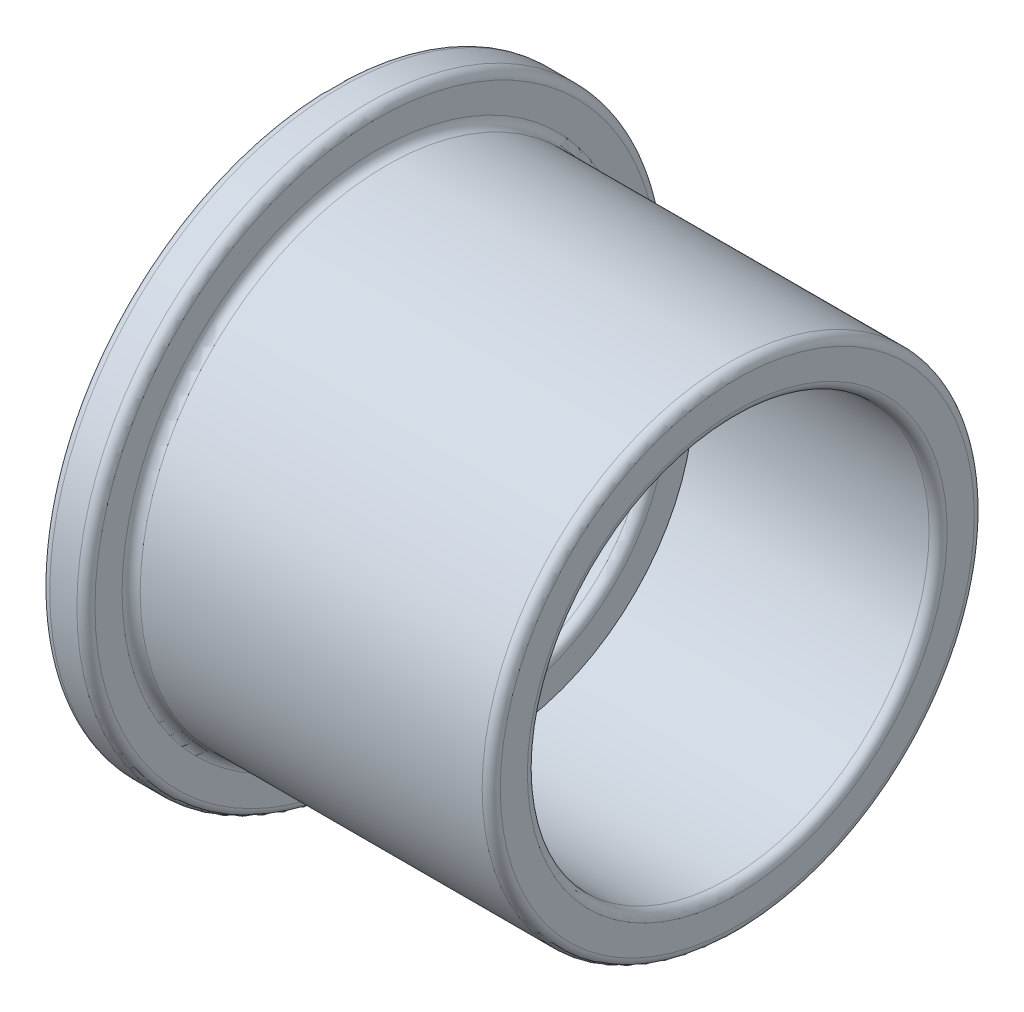
ISO-10303-21;
HEADER;
FILE_DESCRIPTION(('STEP AP214'),'2;1');
FILE_NAME('part.step','',(''),(''),'','','');
FILE_SCHEMA(('AUTOMOTIVE_DESIGN { 1 0 10303 214 1 1 1 1 }'));
ENDSEC;
DATA;
#1=APPLICATION_CONTEXT('core data for automotive mechanical design processes');
#2=APPLICATION_PROTOCOL_DEFINITION('international standard','automotive_design',2000,#1);
#3=PRODUCT_CONTEXT('',#1,'mechanical');
#4=PRODUCT('Part','Part','',(#3));
#5=PRODUCT_RELATED_PRODUCT_CATEGORY('part','',(#4));
#6=PRODUCT_DEFINITION_FORMATION('','',#4);
#7=PRODUCT_DEFINITION_CONTEXT('part definition',#1,'design');
#8=PRODUCT_DEFINITION('design','',#6,#7);
#9=PRODUCT_DEFINITION_SHAPE('','',#8);
#10=(LENGTH_UNIT() NAMED_UNIT(*) SI_UNIT(.MILLI.,.METRE.));
#11=(NAMED_UNIT(*) PLANE_ANGLE_UNIT() SI_UNIT($,.RADIAN.));
#12=(NAMED_UNIT(*) SI_UNIT($,.STERADIAN.) SOLID_ANGLE_UNIT());
#13=UNCERTAINTY_MEASURE_WITH_UNIT(LENGTH_MEASURE(1.E-05),#10,'distance_accuracy_value','');
#14=(GEOMETRIC_REPRESENTATION_CONTEXT(3) GLOBAL_UNCERTAINTY_ASSIGNED_CONTEXT((#13)) GLOBAL_UNIT_ASSIGNED_CONTEXT((#10,
#11,#12)) REPRESENTATION_CONTEXT('',''));
#15=CARTESIAN_POINT('',(0.,0.,0.));
#16=DIRECTION('',(0.,0.,1.));
#17=DIRECTION('',(1.,0.,0.));
#18=AXIS2_PLACEMENT_3D('',#15,#16,#17);
#19=CARTESIAN_POINT('',(-30.8496386192104,0.,0.));
#20=DIRECTION('',(-1.,0.,0.));
#21=DIRECTION('',(0.,0.,1.));
#22=AXIS2_PLACEMENT_3D('',#19,#20,#21);
#23=CYLINDRICAL_SURFACE('',#22,16.1);
#24=CARTESIAN_POINT('',(-10.5,0.,0.));
#25=DIRECTION('',(-1.,0.,0.));
#26=DIRECTION('',(0.,0.,1.));
#27=AXIS2_PLACEMENT_3D('',#24,#25,#26);
#28=CIRCLE('',#27,16.1);
#29=CARTESIAN_POINT('',(-10.5,0.,16.1));
#30=VERTEX_POINT('',#29);
#31=EDGE_CURVE('E75',#30,#30,#28,.T.);
#32=ORIENTED_EDGE('',*,*,#31,.T.);
#33=EDGE_LOOP('',(#32));
#34=FACE_BOUND('',#33,.T.);
#35=CARTESIAN_POINT('',(-12.,0.,0.));
#36=DIRECTION('',(1.,0.,0.));
#37=DIRECTION('',(0.,0.,-1.));
#38=AXIS2_PLACEMENT_3D('',#35,#36,#37);
#39=CIRCLE('',#38,16.1);
#40=CARTESIAN_POINT('',(-12.,0.,-16.1));
#41=VERTEX_POINT('',#40);
#42=EDGE_CURVE('E78',#41,#41,#39,.T.);
#43=ORIENTED_EDGE('',*,*,#42,.T.);
#44=EDGE_LOOP('',(#43));
#45=FACE_BOUND('',#44,.T.);
#46=ADVANCED_FACE('F31',(#34,#45),#23,.T.);
#47=CARTESIAN_POINT('',(-12.5,16.1,0.));
#48=DIRECTION('',(1.,0.,0.));
#49=DIRECTION('',(0.,0.,-1.));
#50=AXIS2_PLACEMENT_3D('',#47,#48,#49);
#51=PLANE('',#50);
#52=CARTESIAN_POINT('',(-12.5,0.,0.));
#53=DIRECTION('',(1.,0.,0.));
#54=DIRECTION('',(0.,0.,-1.));
#55=AXIS2_PLACEMENT_3D('',#52,#53,#54);
#56=CIRCLE('',#55,15.6);
#57=CARTESIAN_POINT('',(-12.5,0.,-15.6));
#58=VERTEX_POINT('',#57);
#59=EDGE_CURVE('E63',#58,#58,#56,.F.);
#60=ORIENTED_EDGE('',*,*,#59,.T.);
#61=EDGE_LOOP('',(#60));
#62=FACE_BOUND('',#61,.T.);
#63=CARTESIAN_POINT('',(-12.5,0.,0.));
#64=DIRECTION('',(1.,0.,0.));
#65=DIRECTION('',(0.,0.,-1.));
#66=AXIS2_PLACEMENT_3D('',#63,#64,#65);
#67=CIRCLE('',#66,9.6);
#68=CARTESIAN_POINT('',(-12.5,0.,-9.6));
#69=VERTEX_POINT('',#68);
#70=EDGE_CURVE('E66',#69,#69,#67,.T.);
#71=ORIENTED_EDGE('',*,*,#70,.T.);
#72=EDGE_LOOP('',(#71));
#73=FACE_BOUND('',#72,.T.);
#74=ADVANCED_FACE('F98',(#62,#73),#51,.F.);
#75=CARTESIAN_POINT('',(-30.8496386192104,0.,0.));
#76=DIRECTION('',(-1.,0.,0.));
#77=DIRECTION('',(0.,0.,1.));
#78=AXIS2_PLACEMENT_3D('',#75,#76,#77);
#79=CYLINDRICAL_SURFACE('',#78,9.1);
#80=CARTESIAN_POINT('',(-12.,0.,0.));
#81=DIRECTION('',(1.,0.,0.));
#82=DIRECTION('',(0.,0.,-1.));
#83=AXIS2_PLACEMENT_3D('',#80,#81,#82);
#84=CIRCLE('',#83,9.1);
#85=CARTESIAN_POINT('',(-12.,0.,-9.1));
#86=VERTEX_POINT('',#85);
#87=EDGE_CURVE('E57',#86,#86,#84,.F.);
#88=ORIENTED_EDGE('',*,*,#87,.T.);
#89=EDGE_LOOP('',(#88));
#90=FACE_BOUND('',#89,.T.);
#91=CARTESIAN_POINT('',(-4.1,0.,0.));
#92=DIRECTION('',(-1.,0.,0.));
#93=DIRECTION('',(0.,0.,1.));
#94=AXIS2_PLACEMENT_3D('',#91,#92,#93);
#95=CIRCLE('',#94,9.1);
#96=CARTESIAN_POINT('',(-4.1,0.,9.1));
#97=VERTEX_POINT('',#96);
#98=EDGE_CURVE('E60',#97,#97,#95,.F.);
#99=ORIENTED_EDGE('',*,*,#98,.T.);
#100=EDGE_LOOP('',(#99));
#101=FACE_BOUND('',#100,.T.);
#102=ADVANCED_FACE('F89',(#90,#101),#79,.F.);
#103=CARTESIAN_POINT('',(-3.6,9.1,0.));
#104=DIRECTION('',(-1.,0.,0.));
#105=DIRECTION('',(0.,0.,1.));
#106=AXIS2_PLACEMENT_3D('',#103,#104,#105);
#107=PLANE('',#106);
#108=CARTESIAN_POINT('',(-3.6,0.,0.));
#109=DIRECTION('',(-1.,0.,0.));
#110=DIRECTION('',(0.,0.,1.));
#111=AXIS2_PLACEMENT_3D('',#108,#109,#110);
#112=CIRCLE('',#111,9.6);
#113=CARTESIAN_POINT('',(-3.6,0.,9.6));
#114=VERTEX_POINT('',#113);
#115=EDGE_CURVE('E54',#114,#114,#112,.T.);
#116=ORIENTED_EDGE('',*,*,#115,.T.);
#117=EDGE_LOOP('',(#116));
#118=FACE_BOUND('',#117,.T.);
#119=CARTESIAN_POINT('',(-3.6,0.,0.));
#120=DIRECTION('',(-1.,0.,0.));
#121=DIRECTION('',(0.,0.,1.));
#122=AXIS2_PLACEMENT_3D('',#119,#120,#121);
#123=CIRCLE('',#122,11.1);
#124=CARTESIAN_POINT('',(-3.6,0.,11.1));
#125=VERTEX_POINT('',#124);
#126=EDGE_CURVE('E81',#125,#125,#123,.T.);
#127=ORIENTED_EDGE('',*,*,#126,.F.);
#128=EDGE_LOOP('',(#127));
#129=FACE_BOUND('',#128,.T.);
#130=ADVANCED_FACE('F87',(#118,#129),#107,.F.);
#131=CARTESIAN_POINT('',(-30.8496386192104,0.,0.));
#132=DIRECTION('',(-1.,0.,0.));
#133=DIRECTION('',(0.,0.,1.));
#134=AXIS2_PLACEMENT_3D('',#131,#132,#133);
#135=CYLINDRICAL_SURFACE('',#134,11.1);
#136=CARTESIAN_POINT('',(9.4,0.,0.));
#137=DIRECTION('',(-1.,0.,0.));
#138=DIRECTION('',(0.,0.,1.));
#139=AXIS2_PLACEMENT_3D('',#136,#137,#138);
#140=CIRCLE('',#139,11.1);
#141=CARTESIAN_POINT('',(9.4,0.,11.1));
#142=VERTEX_POINT('',#141);
#143=EDGE_CURVE('E10',#142,#142,#140,.F.);
#144=ORIENTED_EDGE('',*,*,#143,.T.);
#145=EDGE_LOOP('',(#144));
#146=FACE_BOUND('',#145,.T.);
#147=ORIENTED_EDGE('',*,*,#126,.T.);
#148=EDGE_LOOP('',(#147));
#149=FACE_BOUND('',#148,.T.);
#150=ADVANCED_FACE('F85',(#146,#149),#135,.F.);
#151=CARTESIAN_POINT('',(9.9,11.1,0.));
#152=DIRECTION('',(-1.,0.,0.));
#153=DIRECTION('',(0.,0.,1.));
#154=AXIS2_PLACEMENT_3D('',#151,#152,#153);
#155=PLANE('',#154);
#156=CARTESIAN_POINT('',(9.9,0.,0.));
#157=DIRECTION('',(-1.,0.,0.));
#158=DIRECTION('',(0.,0.,1.));
#159=AXIS2_PLACEMENT_3D('',#156,#157,#158);
#160=CIRCLE('',#159,13.1);
#161=CARTESIAN_POINT('',(9.9,0.,13.1));
#162=VERTEX_POINT('',#161);
#163=EDGE_CURVE('E38',#162,#162,#160,.F.);
#164=ORIENTED_EDGE('',*,*,#163,.T.);
#165=EDGE_LOOP('',(#164));
#166=FACE_BOUND('',#165,.T.);
#167=CARTESIAN_POINT('',(9.9,0.,0.));
#168=DIRECTION('',(-1.,0.,0.));
#169=DIRECTION('',(0.,0.,1.));
#170=AXIS2_PLACEMENT_3D('',#167,#168,#169);
#171=CIRCLE('',#170,11.6);
#172=CARTESIAN_POINT('',(9.9,0.,11.6));
#173=VERTEX_POINT('',#172);
#174=EDGE_CURVE('E42',#173,#173,#171,.T.);
#175=ORIENTED_EDGE('',*,*,#174,.T.);
#176=EDGE_LOOP('',(#175));
#177=FACE_BOUND('',#176,.T.);
#178=ADVANCED_FACE('F96',(#166,#177),#155,.F.);
#179=CARTESIAN_POINT('',(-30.8496386192104,0.,0.));
#180=DIRECTION('',(-1.,0.,0.));
#181=DIRECTION('',(0.,0.,1.));
#182=AXIS2_PLACEMENT_3D('',#179,#180,#181);
#183=CYLINDRICAL_SURFACE('',#182,13.6);
#184=CARTESIAN_POINT('',(9.4,0.,0.));
#185=DIRECTION('',(-1.,0.,0.));
#186=DIRECTION('',(0.,0.,1.));
#187=AXIS2_PLACEMENT_3D('',#184,#185,#186);
#188=CIRCLE('',#187,13.6);
#189=CARTESIAN_POINT('',(9.4,0.,13.6));
#190=VERTEX_POINT('',#189);
#191=EDGE_CURVE('E46',#190,#190,#188,.T.);
#192=ORIENTED_EDGE('',*,*,#191,.T.);
#193=EDGE_LOOP('',(#192));
#194=FACE_BOUND('',#193,.T.);
#195=CARTESIAN_POINT('',(-9.5,0.,0.));
#196=DIRECTION('',(-1.,0.,0.));
#197=DIRECTION('',(0.,0.,1.));
#198=AXIS2_PLACEMENT_3D('',#195,#196,#197);
#199=CIRCLE('',#198,13.6);
#200=CARTESIAN_POINT('',(-9.5,0.,13.6));
#201=VERTEX_POINT('',#200);
#202=EDGE_CURVE('E51',#201,#201,#199,.F.);
#203=ORIENTED_EDGE('',*,*,#202,.T.);
#204=EDGE_LOOP('',(#203));
#205=FACE_BOUND('',#204,.T.);
#206=ADVANCED_FACE('F143',(#194,#205),#183,.T.);
#207=CARTESIAN_POINT('',(-10.,13.6,0.));
#208=DIRECTION('',(-1.,0.,0.));
#209=DIRECTION('',(0.,0.,1.));
#210=AXIS2_PLACEMENT_3D('',#207,#208,#209);
#211=PLANE('',#210);
#212=CARTESIAN_POINT('',(-10.,0.,0.));
#213=DIRECTION('',(-1.,0.,0.));
#214=DIRECTION('',(0.,0.,1.));
#215=AXIS2_PLACEMENT_3D('',#212,#213,#214);
#216=CIRCLE('',#215,15.6);
#217=CARTESIAN_POINT('',(-10.,0.,15.6));
#218=VERTEX_POINT('',#217);
#219=EDGE_CURVE('E69',#218,#218,#216,.F.);
#220=ORIENTED_EDGE('',*,*,#219,.T.);
#221=EDGE_LOOP('',(#220));
#222=FACE_BOUND('',#221,.T.);
#223=CARTESIAN_POINT('',(-10.,0.,0.));
#224=DIRECTION('',(-1.,0.,0.));
#225=DIRECTION('',(0.,0.,1.));
#226=AXIS2_PLACEMENT_3D('',#223,#224,#225);
#227=CIRCLE('',#226,14.1);
#228=CARTESIAN_POINT('',(-10.,0.,14.1));
#229=VERTEX_POINT('',#228);
#230=EDGE_CURVE('E72',#229,#229,#227,.T.);
#231=ORIENTED_EDGE('',*,*,#230,.T.);
#232=EDGE_LOOP('',(#231));
#233=FACE_BOUND('',#232,.T.);
#234=ADVANCED_FACE('F115',(#222,#233),#211,.F.);
#235=CARTESIAN_POINT('',(-10.5,0.,0.));
#236=DIRECTION('',(-1.,0.,0.));
#237=DIRECTION('',(0.,0.,1.));
#238=AXIS2_PLACEMENT_3D('',#235,#236,#237);
#239=TOROIDAL_SURFACE('',#238,15.6,0.5);
#240=ORIENTED_EDGE('',*,*,#219,.F.);
#241=EDGE_LOOP('',(#240));
#242=FACE_BOUND('',#241,.T.);
#243=ORIENTED_EDGE('',*,*,#31,.F.);
#244=EDGE_LOOP('',(#243));
#245=FACE_BOUND('',#244,.T.);
#246=ADVANCED_FACE('F111',(#242,#245),#239,.T.);
#247=CARTESIAN_POINT('',(-12.,0.,0.));
#248=DIRECTION('',(1.,0.,0.));
#249=DIRECTION('',(0.,0.,-1.));
#250=AXIS2_PLACEMENT_3D('',#247,#248,#249);
#251=TOROIDAL_SURFACE('',#250,15.6,0.5);
#252=ORIENTED_EDGE('',*,*,#42,.F.);
#253=EDGE_LOOP('',(#252));
#254=FACE_BOUND('',#253,.T.);
#255=ORIENTED_EDGE('',*,*,#59,.F.);
#256=EDGE_LOOP('',(#255));
#257=FACE_BOUND('',#256,.T.);
#258=ADVANCED_FACE('F114',(#254,#257),#251,.T.);
#259=CARTESIAN_POINT('',(-12.,0.,0.));
#260=DIRECTION('',(1.,0.,0.));
#261=DIRECTION('',(0.,0.,-1.));
#262=AXIS2_PLACEMENT_3D('',#259,#260,#261);
#263=TOROIDAL_SURFACE('',#262,9.6,0.5);
#264=ORIENTED_EDGE('',*,*,#70,.F.);
#265=EDGE_LOOP('',(#264));
#266=FACE_BOUND('',#265,.T.);
#267=ORIENTED_EDGE('',*,*,#87,.F.);
#268=EDGE_LOOP('',(#267));
#269=FACE_BOUND('',#268,.T.);
#270=ADVANCED_FACE('F119',(#266,#269),#263,.T.);
#271=CARTESIAN_POINT('',(-4.1,0.,0.));
#272=DIRECTION('',(-1.,0.,0.));
#273=DIRECTION('',(0.,0.,1.));
#274=AXIS2_PLACEMENT_3D('',#271,#272,#273);
#275=TOROIDAL_SURFACE('',#274,9.6,0.5);
#276=ORIENTED_EDGE('',*,*,#98,.F.);
#277=EDGE_LOOP('',(#276));
#278=FACE_BOUND('',#277,.T.);
#279=ORIENTED_EDGE('',*,*,#115,.F.);
#280=EDGE_LOOP('',(#279));
#281=FACE_BOUND('',#280,.T.);
#282=ADVANCED_FACE('F123',(#278,#281),#275,.T.);
#283=CARTESIAN_POINT('',(9.4,0.,0.));
#284=DIRECTION('',(-1.,0.,0.));
#285=DIRECTION('',(0.,0.,1.));
#286=AXIS2_PLACEMENT_3D('',#283,#284,#285);
#287=TOROIDAL_SURFACE('',#286,13.1,0.5);
#288=ORIENTED_EDGE('',*,*,#163,.F.);
#289=EDGE_LOOP('',(#288));
#290=FACE_BOUND('',#289,.T.);
#291=ORIENTED_EDGE('',*,*,#191,.F.);
#292=EDGE_LOOP('',(#291));
#293=FACE_BOUND('',#292,.T.);
#294=ADVANCED_FACE('F127',(#290,#293),#287,.T.);
#295=CARTESIAN_POINT('',(-9.5,0.,0.));
#296=DIRECTION('',(-1.,0.,0.));
#297=DIRECTION('',(0.,0.,1.));
#298=AXIS2_PLACEMENT_3D('',#295,#296,#297);
#299=TOROIDAL_SURFACE('',#298,14.1,0.5);
#300=ORIENTED_EDGE('',*,*,#202,.F.);
#301=EDGE_LOOP('',(#300));
#302=FACE_BOUND('',#301,.T.);
#303=ORIENTED_EDGE('',*,*,#230,.F.);
#304=EDGE_LOOP('',(#303));
#305=FACE_BOUND('',#304,.T.);
#306=ADVANCED_FACE('F130',(#302,#305),#299,.F.);
#307=CARTESIAN_POINT('',(9.4,0.,0.));
#308=DIRECTION('',(-1.,0.,0.));
#309=DIRECTION('',(0.,0.,1.));
#310=AXIS2_PLACEMENT_3D('',#307,#308,#309);
#311=TOROIDAL_SURFACE('',#310,11.6,0.5);
#312=ORIENTED_EDGE('',*,*,#143,.F.);
#313=EDGE_LOOP('',(#312));
#314=FACE_BOUND('',#313,.T.);
#315=ORIENTED_EDGE('',*,*,#174,.F.);
#316=EDGE_LOOP('',(#315));
#317=FACE_BOUND('',#316,.T.);
#318=ADVANCED_FACE('F33',(#314,#317),#311,.T.);
#319=CLOSED_SHELL('',(#46,#74,#102,#130,#150,#178,#206,#234,#246,#258,#270,#282,#294,#306,#318));
#320=MANIFOLD_SOLID_BREP('B2',#319);
#321=ADVANCED_BREP_SHAPE_REPRESENTATION('',(#18,#320),#14);
#322=SHAPE_DEFINITION_REPRESENTATION(#9,#321);
ENDSEC;
END-ISO-10303-21;
